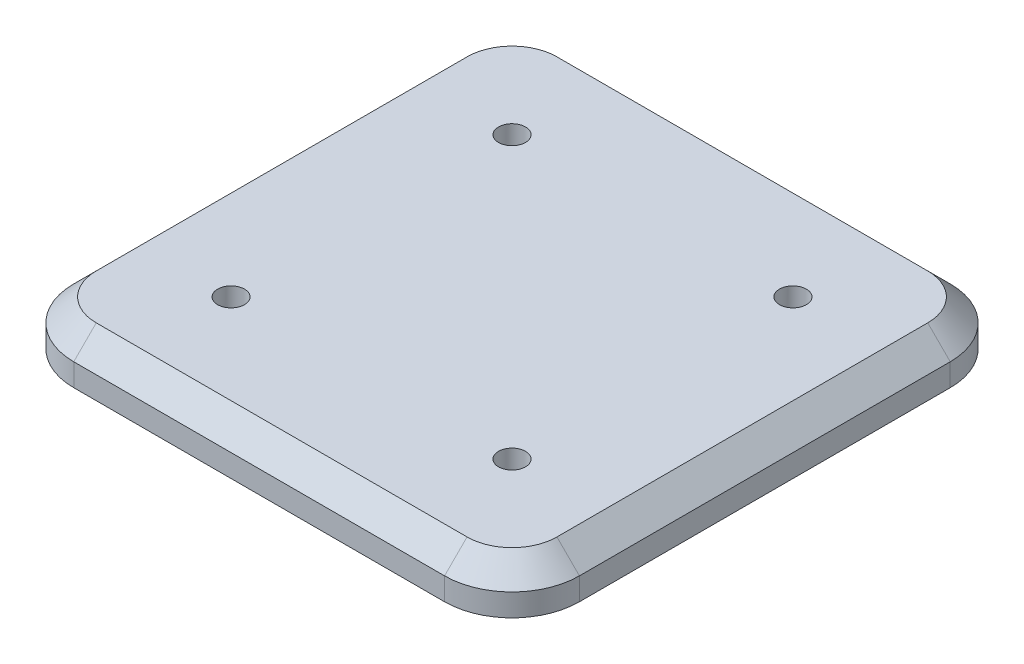
ISO-10303-21;
HEADER;
FILE_DESCRIPTION(('STEP AP214'),'2;1');
FILE_NAME('part.step','',(''),(''),'','','');
FILE_SCHEMA(('AUTOMOTIVE_DESIGN { 1 0 10303 214 1 1 1 1 }'));
ENDSEC;
DATA;
#1=APPLICATION_CONTEXT('core data for automotive mechanical design processes');
#2=APPLICATION_PROTOCOL_DEFINITION('international standard','automotive_design',2000,#1);
#3=PRODUCT_CONTEXT('',#1,'mechanical');
#4=PRODUCT('Part','Part','',(#3));
#5=PRODUCT_RELATED_PRODUCT_CATEGORY('part','',(#4));
#6=PRODUCT_DEFINITION_FORMATION('','',#4);
#7=PRODUCT_DEFINITION_CONTEXT('part definition',#1,'design');
#8=PRODUCT_DEFINITION('design','',#6,#7);
#9=PRODUCT_DEFINITION_SHAPE('','',#8);
#10=(LENGTH_UNIT() NAMED_UNIT(*) SI_UNIT(.MILLI.,.METRE.));
#11=(NAMED_UNIT(*) PLANE_ANGLE_UNIT() SI_UNIT($,.RADIAN.));
#12=(NAMED_UNIT(*) SI_UNIT($,.STERADIAN.) SOLID_ANGLE_UNIT());
#13=UNCERTAINTY_MEASURE_WITH_UNIT(LENGTH_MEASURE(1.E-05),#10,'distance_accuracy_value','');
#14=(GEOMETRIC_REPRESENTATION_CONTEXT(3) GLOBAL_UNCERTAINTY_ASSIGNED_CONTEXT((#13)) GLOBAL_UNIT_ASSIGNED_CONTEXT((#10,
#11,#12)) REPRESENTATION_CONTEXT('',''));
#15=CARTESIAN_POINT('',(0.,0.,0.));
#16=DIRECTION('',(0.,0.,1.));
#17=DIRECTION('',(1.,0.,0.));
#18=AXIS2_PLACEMENT_3D('',#15,#16,#17);
#19=CARTESIAN_POINT('',(-82.5,10.,82.5));
#20=DIRECTION('',(0.,-1.,0.));
#21=DIRECTION('',(0.,0.,-1.));
#22=AXIS2_PLACEMENT_3D('',#19,#20,#21);
#23=CYLINDRICAL_SURFACE('',#22,30.);
#24=DIRECTION('',(0.,-1.,0.));
#25=VECTOR('',#24,1.);
#26=CARTESIAN_POINT('',(-82.5,10.,112.5));
#27=LINE('',#26,#25);
#28=CARTESIAN_POINT('',(-82.5,-1.26634813746307E-13,112.5));
#29=VERTEX_POINT('',#28);
#30=CARTESIAN_POINT('',(-82.5,-10.,112.5));
#31=VERTEX_POINT('',#30);
#32=EDGE_CURVE('E130',#29,#31,#27,.T.);
#33=ORIENTED_EDGE('',*,*,#32,.F.);
#34=CARTESIAN_POINT('',(-82.5,-1.26634813746307E-13,82.5));
#35=DIRECTION('',(0.,-1.,0.));
#36=DIRECTION('',(0.,0.,-1.));
#37=AXIS2_PLACEMENT_3D('',#34,#35,#36);
#38=CIRCLE('',#37,30.);
#39=CARTESIAN_POINT('',(-112.5,-1.26634813746307E-13,82.5));
#40=VERTEX_POINT('',#39);
#41=EDGE_CURVE('E12',#29,#40,#38,.T.);
#42=ORIENTED_EDGE('',*,*,#41,.T.);
#43=DIRECTION('',(0.,-1.,0.));
#44=VECTOR('',#43,1.);
#45=CARTESIAN_POINT('',(-112.5,10.,82.5));
#46=LINE('',#45,#44);
#47=CARTESIAN_POINT('',(-112.5,-10.,82.5));
#48=VERTEX_POINT('',#47);
#49=EDGE_CURVE('E151',#40,#48,#46,.T.);
#50=ORIENTED_EDGE('',*,*,#49,.T.);
#51=CARTESIAN_POINT('',(-82.5,-10.,82.5));
#52=DIRECTION('',(0.,1.,0.));
#53=DIRECTION('',(0.,0.,-1.));
#54=AXIS2_PLACEMENT_3D('',#51,#52,#53);
#55=CIRCLE('',#54,30.);
#56=EDGE_CURVE('E145',#48,#31,#55,.T.);
#57=ORIENTED_EDGE('',*,*,#56,.T.);
#58=EDGE_LOOP('',(#33,#42,#50,#57));
#59=FACE_BOUND('',#58,.T.);
#60=ADVANCED_FACE('F41',(#59),#23,.T.);
#61=CARTESIAN_POINT('',(82.5,10.,112.5));
#62=DIRECTION('',(0.,0.,-1.));
#63=DIRECTION('',(-1.,0.,0.));
#64=AXIS2_PLACEMENT_3D('',#61,#62,#63);
#65=PLANE('',#64);
#66=DIRECTION('',(0.,-1.,0.));
#67=VECTOR('',#66,1.);
#68=CARTESIAN_POINT('',(82.5,10.,112.5));
#69=LINE('',#68,#67);
#70=CARTESIAN_POINT('',(82.5,-1.26634813746307E-13,112.5));
#71=VERTEX_POINT('',#70);
#72=CARTESIAN_POINT('',(82.5,-10.,112.5));
#73=VERTEX_POINT('',#72);
#74=EDGE_CURVE('E139',#71,#73,#69,.T.);
#75=ORIENTED_EDGE('',*,*,#74,.F.);
#76=DIRECTION('',(-1.,0.,0.));
#77=VECTOR('',#76,1.);
#78=CARTESIAN_POINT('',(82.5,-1.26634813746307E-13,112.5));
#79=LINE('',#78,#77);
#80=EDGE_CURVE('E51',#71,#29,#79,.T.);
#81=ORIENTED_EDGE('',*,*,#80,.T.);
#82=ORIENTED_EDGE('',*,*,#32,.T.);
#83=DIRECTION('',(1.,0.,0.));
#84=VECTOR('',#83,1.);
#85=CARTESIAN_POINT('',(82.5,-10.,112.5));
#86=LINE('',#85,#84);
#87=EDGE_CURVE('E133',#31,#73,#86,.T.);
#88=ORIENTED_EDGE('',*,*,#87,.T.);
#89=EDGE_LOOP('',(#75,#81,#82,#88));
#90=FACE_BOUND('',#89,.T.);
#91=ADVANCED_FACE('F132',(#90),#65,.F.);
#92=CARTESIAN_POINT('',(82.5,10.,82.5));
#93=DIRECTION('',(0.,-1.,0.));
#94=DIRECTION('',(0.,0.,-1.));
#95=AXIS2_PLACEMENT_3D('',#92,#93,#94);
#96=CYLINDRICAL_SURFACE('',#95,30.);
#97=DIRECTION('',(0.,-1.,0.));
#98=VECTOR('',#97,1.);
#99=CARTESIAN_POINT('',(112.5,10.,82.5));
#100=LINE('',#99,#98);
#101=CARTESIAN_POINT('',(112.5,-1.26634813746307E-13,82.5));
#102=VERTEX_POINT('',#101);
#103=CARTESIAN_POINT('',(112.5,-10.,82.5));
#104=VERTEX_POINT('',#103);
#105=EDGE_CURVE('E184',#102,#104,#100,.T.);
#106=ORIENTED_EDGE('',*,*,#105,.F.);
#107=CARTESIAN_POINT('',(82.5,-1.26634813746307E-13,82.5));
#108=DIRECTION('',(0.,-1.,0.));
#109=DIRECTION('',(0.,0.,-1.));
#110=AXIS2_PLACEMENT_3D('',#107,#108,#109);
#111=CIRCLE('',#110,30.);
#112=EDGE_CURVE('E66',#102,#71,#111,.T.);
#113=ORIENTED_EDGE('',*,*,#112,.T.);
#114=ORIENTED_EDGE('',*,*,#74,.T.);
#115=CARTESIAN_POINT('',(82.5,-10.,82.5));
#116=DIRECTION('',(0.,1.,0.));
#117=DIRECTION('',(0.,0.,-1.));
#118=AXIS2_PLACEMENT_3D('',#115,#116,#117);
#119=CIRCLE('',#118,30.);
#120=EDGE_CURVE('E148',#73,#104,#119,.T.);
#121=ORIENTED_EDGE('',*,*,#120,.T.);
#122=EDGE_LOOP('',(#106,#113,#114,#121));
#123=FACE_BOUND('',#122,.T.);
#124=ADVANCED_FACE('F287',(#123),#96,.T.);
#125=CARTESIAN_POINT('',(112.5,10.,-82.5));
#126=DIRECTION('',(-1.,0.,0.));
#127=DIRECTION('',(0.,0.,1.));
#128=AXIS2_PLACEMENT_3D('',#125,#126,#127);
#129=PLANE('',#128);
#130=DIRECTION('',(0.,-1.,0.));
#131=VECTOR('',#130,1.);
#132=CARTESIAN_POINT('',(112.5,10.,-82.5));
#133=LINE('',#132,#131);
#134=CARTESIAN_POINT('',(112.5,-1.26634813746307E-13,-82.5));
#135=VERTEX_POINT('',#134);
#136=CARTESIAN_POINT('',(112.5,-10.,-82.5));
#137=VERTEX_POINT('',#136);
#138=EDGE_CURVE('E182',#135,#137,#133,.T.);
#139=ORIENTED_EDGE('',*,*,#138,.F.);
#140=DIRECTION('',(0.,0.,1.));
#141=VECTOR('',#140,1.);
#142=CARTESIAN_POINT('',(112.5,-1.26634813746307E-13,-82.5));
#143=LINE('',#142,#141);
#144=EDGE_CURVE('E212',#135,#102,#143,.T.);
#145=ORIENTED_EDGE('',*,*,#144,.T.);
#146=ORIENTED_EDGE('',*,*,#105,.T.);
#147=DIRECTION('',(0.,0.,-1.));
#148=VECTOR('',#147,1.);
#149=CARTESIAN_POINT('',(112.5,-10.,-82.5));
#150=LINE('',#149,#148);
#151=EDGE_CURVE('E161',#104,#137,#150,.T.);
#152=ORIENTED_EDGE('',*,*,#151,.T.);
#153=EDGE_LOOP('',(#139,#145,#146,#152));
#154=FACE_BOUND('',#153,.T.);
#155=ADVANCED_FACE('F285',(#154),#129,.F.);
#156=CARTESIAN_POINT('',(82.5,10.,-82.5));
#157=DIRECTION('',(0.,-1.,0.));
#158=DIRECTION('',(0.,0.,-1.));
#159=AXIS2_PLACEMENT_3D('',#156,#157,#158);
#160=CYLINDRICAL_SURFACE('',#159,30.);
#161=DIRECTION('',(0.,-1.,0.));
#162=VECTOR('',#161,1.);
#163=CARTESIAN_POINT('',(82.4999999999999,10.,-112.5));
#164=LINE('',#163,#162);
#165=CARTESIAN_POINT('',(82.4999999999999,-1.26634813746307E-13,-112.5));
#166=VERTEX_POINT('',#165);
#167=CARTESIAN_POINT('',(82.4999999999999,-10.,-112.5));
#168=VERTEX_POINT('',#167);
#169=EDGE_CURVE('E180',#166,#168,#164,.T.);
#170=ORIENTED_EDGE('',*,*,#169,.F.);
#171=CARTESIAN_POINT('',(82.5,-1.26634813746307E-13,-82.5));
#172=DIRECTION('',(0.,-1.,0.));
#173=DIRECTION('',(0.,0.,-1.));
#174=AXIS2_PLACEMENT_3D('',#171,#172,#173);
#175=CIRCLE('',#174,30.);
#176=EDGE_CURVE('E210',#166,#135,#175,.T.);
#177=ORIENTED_EDGE('',*,*,#176,.T.);
#178=ORIENTED_EDGE('',*,*,#138,.T.);
#179=CARTESIAN_POINT('',(82.5,-10.,-82.5));
#180=DIRECTION('',(0.,1.,0.));
#181=DIRECTION('',(0.,0.,-1.));
#182=AXIS2_PLACEMENT_3D('',#179,#180,#181);
#183=CIRCLE('',#182,30.);
#184=EDGE_CURVE('E164',#137,#168,#183,.T.);
#185=ORIENTED_EDGE('',*,*,#184,.T.);
#186=EDGE_LOOP('',(#170,#177,#178,#185));
#187=FACE_BOUND('',#186,.T.);
#188=ADVANCED_FACE('F283',(#187),#160,.T.);
#189=CARTESIAN_POINT('',(-82.5,10.,-112.5));
#190=DIRECTION('',(0.,0.,1.));
#191=DIRECTION('',(1.,0.,0.));
#192=AXIS2_PLACEMENT_3D('',#189,#190,#191);
#193=PLANE('',#192);
#194=DIRECTION('',(0.,-1.,0.));
#195=VECTOR('',#194,1.);
#196=CARTESIAN_POINT('',(-82.5,10.,-112.5));
#197=LINE('',#196,#195);
#198=CARTESIAN_POINT('',(-82.5,-1.26634813746307E-13,-112.5));
#199=VERTEX_POINT('',#198);
#200=CARTESIAN_POINT('',(-82.5,-10.,-112.5));
#201=VERTEX_POINT('',#200);
#202=EDGE_CURVE('E178',#199,#201,#197,.T.);
#203=ORIENTED_EDGE('',*,*,#202,.F.);
#204=DIRECTION('',(1.,0.,0.));
#205=VECTOR('',#204,1.);
#206=CARTESIAN_POINT('',(-82.5,-1.26634813746307E-13,-112.5));
#207=LINE('',#206,#205);
#208=EDGE_CURVE('E208',#199,#166,#207,.T.);
#209=ORIENTED_EDGE('',*,*,#208,.T.);
#210=ORIENTED_EDGE('',*,*,#169,.T.);
#211=DIRECTION('',(-1.,0.,0.));
#212=VECTOR('',#211,1.);
#213=CARTESIAN_POINT('',(-82.5,-10.,-112.5));
#214=LINE('',#213,#212);
#215=EDGE_CURVE('E167',#168,#201,#214,.T.);
#216=ORIENTED_EDGE('',*,*,#215,.T.);
#217=EDGE_LOOP('',(#203,#209,#210,#216));
#218=FACE_BOUND('',#217,.T.);
#219=ADVANCED_FACE('F271',(#218),#193,.F.);
#220=CARTESIAN_POINT('',(-82.5,10.,-82.5));
#221=DIRECTION('',(0.,-1.,0.));
#222=DIRECTION('',(0.,0.,-1.));
#223=AXIS2_PLACEMENT_3D('',#220,#221,#222);
#224=CYLINDRICAL_SURFACE('',#223,30.);
#225=DIRECTION('',(0.,-1.,0.));
#226=VECTOR('',#225,1.);
#227=CARTESIAN_POINT('',(-112.5,10.,-82.5));
#228=LINE('',#227,#226);
#229=CARTESIAN_POINT('',(-112.5,-1.26634813746307E-13,-82.5));
#230=VERTEX_POINT('',#229);
#231=CARTESIAN_POINT('',(-112.5,-10.,-82.5));
#232=VERTEX_POINT('',#231);
#233=EDGE_CURVE('E176',#230,#232,#228,.T.);
#234=ORIENTED_EDGE('',*,*,#233,.F.);
#235=CARTESIAN_POINT('',(-82.5,-1.26634813746307E-13,-82.5));
#236=DIRECTION('',(0.,-1.,0.));
#237=DIRECTION('',(0.,0.,-1.));
#238=AXIS2_PLACEMENT_3D('',#235,#236,#237);
#239=CIRCLE('',#238,30.);
#240=EDGE_CURVE('E206',#230,#199,#239,.T.);
#241=ORIENTED_EDGE('',*,*,#240,.T.);
#242=ORIENTED_EDGE('',*,*,#202,.T.);
#243=CARTESIAN_POINT('',(-82.5,-10.,-82.5));
#244=DIRECTION('',(0.,1.,0.));
#245=DIRECTION('',(0.,0.,1.));
#246=AXIS2_PLACEMENT_3D('',#243,#244,#245);
#247=CIRCLE('',#246,30.);
#248=EDGE_CURVE('E170',#201,#232,#247,.T.);
#249=ORIENTED_EDGE('',*,*,#248,.T.);
#250=EDGE_LOOP('',(#234,#241,#242,#249));
#251=FACE_BOUND('',#250,.T.);
#252=ADVANCED_FACE('F268',(#251),#224,.T.);
#253=CARTESIAN_POINT('',(-112.5,10.,82.5));
#254=DIRECTION('',(1.,0.,0.));
#255=DIRECTION('',(0.,0.,-1.));
#256=AXIS2_PLACEMENT_3D('',#253,#254,#255);
#257=PLANE('',#256);
#258=ORIENTED_EDGE('',*,*,#49,.F.);
#259=DIRECTION('',(0.,0.,-1.));
#260=VECTOR('',#259,1.);
#261=CARTESIAN_POINT('',(-112.5,-1.26634813746307E-13,82.5));
#262=LINE('',#261,#260);
#263=EDGE_CURVE('E203',#40,#230,#262,.T.);
#264=ORIENTED_EDGE('',*,*,#263,.T.);
#265=ORIENTED_EDGE('',*,*,#233,.T.);
#266=DIRECTION('',(0.,0.,1.));
#267=VECTOR('',#266,1.);
#268=CARTESIAN_POINT('',(-112.5,-10.,82.5));
#269=LINE('',#268,#267);
#270=EDGE_CURVE('E173',#232,#48,#269,.T.);
#271=ORIENTED_EDGE('',*,*,#270,.T.);
#272=EDGE_LOOP('',(#258,#264,#265,#271));
#273=FACE_BOUND('',#272,.T.);
#274=ADVANCED_FACE('F255',(#273),#257,.F.);
#275=CARTESIAN_POINT('',(-82.5,10.,82.5));
#276=DIRECTION('',(0.,-1.,0.));
#277=DIRECTION('',(0.,0.,-1.));
#278=AXIS2_PLACEMENT_3D('',#275,#276,#277);
#279=PLANE('',#278);
#280=CARTESIAN_POINT('',(-62.4999999999999,10.,-62.4999999999999));
#281=DIRECTION('',(0.,1.,0.));
#282=DIRECTION('',(0.,0.,-1.));
#283=AXIS2_PLACEMENT_3D('',#280,#281,#282);
#284=CIRCLE('',#283,6.);
#285=CARTESIAN_POINT('',(-62.4999999999999,10.,-68.4999999999999));
#286=VERTEX_POINT('',#285);
#287=EDGE_CURVE('E579',#286,#286,#284,.T.);
#288=ORIENTED_EDGE('',*,*,#287,.F.);
#289=EDGE_LOOP('',(#288));
#290=FACE_BOUND('',#289,.T.);
#291=CARTESIAN_POINT('',(62.5,10.,62.5));
#292=DIRECTION('',(0.,1.,0.));
#293=DIRECTION('',(0.,0.,-1.));
#294=AXIS2_PLACEMENT_3D('',#291,#292,#293);
#295=CIRCLE('',#294,6.);
#296=CARTESIAN_POINT('',(62.5,10.,56.5));
#297=VERTEX_POINT('',#296);
#298=EDGE_CURVE('E578',#297,#297,#295,.T.);
#299=ORIENTED_EDGE('',*,*,#298,.F.);
#300=EDGE_LOOP('',(#299));
#301=FACE_BOUND('',#300,.T.);
#302=CARTESIAN_POINT('',(-62.4999999999999,10.,62.4999999999999));
#303=DIRECTION('',(0.,1.,0.));
#304=DIRECTION('',(0.,0.,1.));
#305=AXIS2_PLACEMENT_3D('',#302,#303,#304);
#306=CIRCLE('',#305,6.);
#307=CARTESIAN_POINT('',(-62.4999999999999,10.,68.4999999999999));
#308=VERTEX_POINT('',#307);
#309=EDGE_CURVE('E572',#308,#308,#306,.T.);
#310=ORIENTED_EDGE('',*,*,#309,.F.);
#311=EDGE_LOOP('',(#310));
#312=FACE_BOUND('',#311,.T.);
#313=CARTESIAN_POINT('',(62.5,10.,-62.5));
#314=DIRECTION('',(0.,1.,0.));
#315=DIRECTION('',(0.,0.,1.));
#316=AXIS2_PLACEMENT_3D('',#313,#314,#315);
#317=CIRCLE('',#316,6.);
#318=CARTESIAN_POINT('',(62.5,10.,-56.5));
#319=VERTEX_POINT('',#318);
#320=EDGE_CURVE('E586',#319,#319,#317,.T.);
#321=ORIENTED_EDGE('',*,*,#320,.F.);
#322=EDGE_LOOP('',(#321));
#323=FACE_BOUND('',#322,.T.);
#324=CARTESIAN_POINT('',(-82.5,10.,-82.5));
#325=DIRECTION('',(0.,-1.,0.));
#326=DIRECTION('',(0.,0.,-1.));
#327=AXIS2_PLACEMENT_3D('',#324,#325,#326);
#328=CIRCLE('',#327,19.9999999999999);
#329=CARTESIAN_POINT('',(-82.5,10.,-102.5));
#330=VERTEX_POINT('',#329);
#331=CARTESIAN_POINT('',(-102.5,10.,-82.5));
#332=VERTEX_POINT('',#331);
#333=EDGE_CURVE('E198',#330,#332,#328,.F.);
#334=ORIENTED_EDGE('',*,*,#333,.T.);
#335=DIRECTION('',(0.,0.,1.));
#336=VECTOR('',#335,1.);
#337=CARTESIAN_POINT('',(-102.5,10.,82.5));
#338=LINE('',#337,#336);
#339=CARTESIAN_POINT('',(-102.5,10.,82.5));
#340=VERTEX_POINT('',#339);
#341=EDGE_CURVE('E200',#332,#340,#338,.T.);
#342=ORIENTED_EDGE('',*,*,#341,.T.);
#343=CARTESIAN_POINT('',(-82.5,10.,82.5));
#344=DIRECTION('',(0.,-1.,0.));
#345=DIRECTION('',(0.,0.,-1.));
#346=AXIS2_PLACEMENT_3D('',#343,#344,#345);
#347=CIRCLE('',#346,19.9999999999999);
#348=CARTESIAN_POINT('',(-82.5,10.,102.5));
#349=VERTEX_POINT('',#348);
#350=EDGE_CURVE('E138',#340,#349,#347,.F.);
#351=ORIENTED_EDGE('',*,*,#350,.T.);
#352=DIRECTION('',(1.,0.,0.));
#353=VECTOR('',#352,1.);
#354=CARTESIAN_POINT('',(-82.5,10.,102.5));
#355=LINE('',#354,#353);
#356=CARTESIAN_POINT('',(82.5,10.,102.5));
#357=VERTEX_POINT('',#356);
#358=EDGE_CURVE('E188',#349,#357,#355,.T.);
#359=ORIENTED_EDGE('',*,*,#358,.T.);
#360=CARTESIAN_POINT('',(82.5,10.,82.5));
#361=DIRECTION('',(0.,-1.,0.));
#362=DIRECTION('',(0.,0.,-1.));
#363=AXIS2_PLACEMENT_3D('',#360,#361,#362);
#364=CIRCLE('',#363,19.9999999999999);
#365=CARTESIAN_POINT('',(102.5,10.,82.5));
#366=VERTEX_POINT('',#365);
#367=EDGE_CURVE('E190',#357,#366,#364,.F.);
#368=ORIENTED_EDGE('',*,*,#367,.T.);
#369=DIRECTION('',(0.,0.,-1.));
#370=VECTOR('',#369,1.);
#371=CARTESIAN_POINT('',(102.5,10.,82.5));
#372=LINE('',#371,#370);
#373=CARTESIAN_POINT('',(102.5,10.,-82.5));
#374=VERTEX_POINT('',#373);
#375=EDGE_CURVE('E192',#366,#374,#372,.T.);
#376=ORIENTED_EDGE('',*,*,#375,.T.);
#377=CARTESIAN_POINT('',(82.5,10.,-82.5));
#378=DIRECTION('',(0.,-1.,0.));
#379=DIRECTION('',(0.,0.,-1.));
#380=AXIS2_PLACEMENT_3D('',#377,#378,#379);
#381=CIRCLE('',#380,19.9999999999999);
#382=CARTESIAN_POINT('',(82.4999999999999,10.,-102.5));
#383=VERTEX_POINT('',#382);
#384=EDGE_CURVE('E194',#374,#383,#381,.F.);
#385=ORIENTED_EDGE('',*,*,#384,.T.);
#386=DIRECTION('',(-1.,0.,0.));
#387=VECTOR('',#386,1.);
#388=CARTESIAN_POINT('',(-82.5,10.,-102.5));
#389=LINE('',#388,#387);
#390=EDGE_CURVE('E196',#383,#330,#389,.T.);
#391=ORIENTED_EDGE('',*,*,#390,.T.);
#392=EDGE_LOOP('',(#334,#342,#351,#359,#368,#376,#385,#391));
#393=FACE_BOUND('',#392,.T.);
#394=ADVANCED_FACE('F243',(#290,#301,#312,#323,#393),#279,.F.);
#395=CARTESIAN_POINT('',(-82.5,-10.,82.5));
#396=DIRECTION('',(0.,-1.,0.));
#397=DIRECTION('',(0.,0.,-1.));
#398=AXIS2_PLACEMENT_3D('',#395,#396,#397);
#399=PLANE('',#398);
#400=CARTESIAN_POINT('',(-87.5,-10.,87.4999999999999));
#401=DIRECTION('',(0.,-1.,0.));
#402=DIRECTION('',(0.,0.,1.));
#403=AXIS2_PLACEMENT_3D('',#400,#401,#402);
#404=CIRCLE('',#403,6.);
#405=CARTESIAN_POINT('',(-87.5,-10.,93.4999999999999));
#406=VERTEX_POINT('',#405);
#407=EDGE_CURVE('E554',#406,#406,#404,.T.);
#408=ORIENTED_EDGE('',*,*,#407,.F.);
#409=EDGE_LOOP('',(#408));
#410=FACE_BOUND('',#409,.T.);
#411=CARTESIAN_POINT('',(87.5,-10.,-87.5));
#412=DIRECTION('',(0.,-1.,0.));
#413=DIRECTION('',(0.,0.,1.));
#414=AXIS2_PLACEMENT_3D('',#411,#412,#413);
#415=CIRCLE('',#414,6.);
#416=CARTESIAN_POINT('',(87.5,-10.,-81.5));
#417=VERTEX_POINT('',#416);
#418=EDGE_CURVE('E564',#417,#417,#415,.T.);
#419=ORIENTED_EDGE('',*,*,#418,.F.);
#420=EDGE_LOOP('',(#419));
#421=FACE_BOUND('',#420,.T.);
#422=CARTESIAN_POINT('',(-87.5,-10.,-87.4999999999999));
#423=DIRECTION('',(0.,-1.,0.));
#424=DIRECTION('',(0.,0.,-1.));
#425=AXIS2_PLACEMENT_3D('',#422,#423,#424);
#426=CIRCLE('',#425,6.);
#427=CARTESIAN_POINT('',(-87.5,-10.,-93.4999999999999));
#428=VERTEX_POINT('',#427);
#429=EDGE_CURVE('E617',#428,#428,#426,.T.);
#430=ORIENTED_EDGE('',*,*,#429,.F.);
#431=EDGE_LOOP('',(#430));
#432=FACE_BOUND('',#431,.T.);
#433=CARTESIAN_POINT('',(87.5,-10.,87.5));
#434=DIRECTION('',(0.,-1.,0.));
#435=DIRECTION('',(0.,0.,-1.));
#436=AXIS2_PLACEMENT_3D('',#433,#434,#435);
#437=CIRCLE('',#436,6.);
#438=CARTESIAN_POINT('',(87.5,-10.,81.5));
#439=VERTEX_POINT('',#438);
#440=EDGE_CURVE('E553',#439,#439,#437,.T.);
#441=ORIENTED_EDGE('',*,*,#440,.F.);
#442=EDGE_LOOP('',(#441));
#443=FACE_BOUND('',#442,.T.);
#444=ORIENTED_EDGE('',*,*,#56,.F.);
#445=ORIENTED_EDGE('',*,*,#270,.F.);
#446=ORIENTED_EDGE('',*,*,#248,.F.);
#447=ORIENTED_EDGE('',*,*,#215,.F.);
#448=ORIENTED_EDGE('',*,*,#184,.F.);
#449=ORIENTED_EDGE('',*,*,#151,.F.);
#450=ORIENTED_EDGE('',*,*,#120,.F.);
#451=ORIENTED_EDGE('',*,*,#87,.F.);
#452=EDGE_LOOP('',(#444,#445,#446,#447,#448,#449,#450,#451));
#453=FACE_BOUND('',#452,.T.);
#454=ADVANCED_FACE('F143',(#410,#421,#432,#443,#453),#399,.T.);
#455=CARTESIAN_POINT('',(102.5,10.,82.5));
#456=DIRECTION('',(-0.707106781186549,-0.707106781186546,0.));
#457=DIRECTION('',(0.,0.,-1.));
#458=AXIS2_PLACEMENT_3D('',#455,#456,#457);
#459=PLANE('',#458);
#460=DIRECTION('',(-0.707106781186546,0.707106781186549,0.));
#461=VECTOR('',#460,1.);
#462=CARTESIAN_POINT('',(112.5,-1.26634813746307E-13,82.5));
#463=LINE('',#462,#461);
#464=EDGE_CURVE('E155',#102,#366,#463,.T.);
#465=ORIENTED_EDGE('',*,*,#464,.F.);
#466=ORIENTED_EDGE('',*,*,#144,.F.);
#467=DIRECTION('',(0.707106781186546,-0.707106781186549,0.));
#468=VECTOR('',#467,1.);
#469=CARTESIAN_POINT('',(102.5,10.,-82.5));
#470=LINE('',#469,#468);
#471=EDGE_CURVE('E46',#374,#135,#470,.T.);
#472=ORIENTED_EDGE('',*,*,#471,.F.);
#473=ORIENTED_EDGE('',*,*,#375,.F.);
#474=EDGE_LOOP('',(#465,#466,#472,#473));
#475=FACE_BOUND('',#474,.T.);
#476=ADVANCED_FACE('F44',(#475),#459,.F.);
#477=CARTESIAN_POINT('',(82.5,10.,-82.5));
#478=DIRECTION('',(0.,-1.,0.));
#479=DIRECTION('',(0.,0.,-1.));
#480=AXIS2_PLACEMENT_3D('',#477,#478,#479);
#481=CONICAL_SURFACE('',#480,19.9999999999999,0.785398163397446);
#482=ORIENTED_EDGE('',*,*,#471,.T.);
#483=ORIENTED_EDGE('',*,*,#176,.F.);
#484=DIRECTION('',(0.,-0.707106781186549,-0.707106781186546));
#485=VECTOR('',#484,1.);
#486=CARTESIAN_POINT('',(82.4999999999999,10.,-102.5));
#487=LINE('',#486,#485);
#488=EDGE_CURVE('E229',#383,#166,#487,.T.);
#489=ORIENTED_EDGE('',*,*,#488,.F.);
#490=ORIENTED_EDGE('',*,*,#384,.F.);
#491=EDGE_LOOP('',(#482,#483,#489,#490));
#492=FACE_BOUND('',#491,.T.);
#493=ADVANCED_FACE('F280',(#492),#481,.T.);
#494=CARTESIAN_POINT('',(82.5,10.,82.5));
#495=DIRECTION('',(0.,-1.,0.));
#496=DIRECTION('',(0.,0.,-1.));
#497=AXIS2_PLACEMENT_3D('',#494,#495,#496);
#498=CONICAL_SURFACE('',#497,19.9999999999999,0.785398163397446);
#499=ORIENTED_EDGE('',*,*,#464,.T.);
#500=ORIENTED_EDGE('',*,*,#367,.F.);
#501=DIRECTION('',(0.,0.707106781186549,-0.707106781186546));
#502=VECTOR('',#501,1.);
#503=CARTESIAN_POINT('',(82.5,-1.26634813746307E-13,112.5));
#504=LINE('',#503,#502);
#505=EDGE_CURVE('E226',#71,#357,#504,.T.);
#506=ORIENTED_EDGE('',*,*,#505,.F.);
#507=ORIENTED_EDGE('',*,*,#112,.F.);
#508=EDGE_LOOP('',(#499,#500,#506,#507));
#509=FACE_BOUND('',#508,.T.);
#510=ADVANCED_FACE('F235',(#509),#498,.T.);
#511=CARTESIAN_POINT('',(-82.5,10.,-102.5));
#512=DIRECTION('',(0.,-0.707106781186546,0.707106781186549));
#513=DIRECTION('',(-1.,0.,0.));
#514=AXIS2_PLACEMENT_3D('',#511,#512,#513);
#515=PLANE('',#514);
#516=ORIENTED_EDGE('',*,*,#488,.T.);
#517=ORIENTED_EDGE('',*,*,#208,.F.);
#518=DIRECTION('',(0.,-0.707106781186549,-0.707106781186546));
#519=VECTOR('',#518,1.);
#520=CARTESIAN_POINT('',(-82.5,10.,-102.5));
#521=LINE('',#520,#519);
#522=EDGE_CURVE('E223',#330,#199,#521,.T.);
#523=ORIENTED_EDGE('',*,*,#522,.F.);
#524=ORIENTED_EDGE('',*,*,#390,.F.);
#525=EDGE_LOOP('',(#516,#517,#523,#524));
#526=FACE_BOUND('',#525,.T.);
#527=ADVANCED_FACE('F276',(#526),#515,.F.);
#528=CARTESIAN_POINT('',(-82.5,10.,102.5));
#529=DIRECTION('',(0.,-0.707106781186546,-0.707106781186549));
#530=DIRECTION('',(1.,0.,0.));
#531=AXIS2_PLACEMENT_3D('',#528,#529,#530);
#532=PLANE('',#531);
#533=ORIENTED_EDGE('',*,*,#505,.T.);
#534=ORIENTED_EDGE('',*,*,#358,.F.);
#535=DIRECTION('',(0.,0.707106781186549,-0.707106781186546));
#536=VECTOR('',#535,1.);
#537=CARTESIAN_POINT('',(-82.5,-1.26634813746307E-13,112.5));
#538=LINE('',#537,#536);
#539=EDGE_CURVE('E220',#29,#349,#538,.T.);
#540=ORIENTED_EDGE('',*,*,#539,.F.);
#541=ORIENTED_EDGE('',*,*,#80,.F.);
#542=EDGE_LOOP('',(#533,#534,#540,#541));
#543=FACE_BOUND('',#542,.T.);
#544=ADVANCED_FACE('F248',(#543),#532,.F.);
#545=CARTESIAN_POINT('',(-82.5,10.,-82.5));
#546=DIRECTION('',(0.,-1.,0.));
#547=DIRECTION('',(0.,0.,-1.));
#548=AXIS2_PLACEMENT_3D('',#545,#546,#547);
#549=CONICAL_SURFACE('',#548,19.9999999999999,0.785398163397446);
#550=ORIENTED_EDGE('',*,*,#522,.T.);
#551=ORIENTED_EDGE('',*,*,#240,.F.);
#552=DIRECTION('',(-0.707106781186546,-0.707106781186549,0.));
#553=VECTOR('',#552,1.);
#554=CARTESIAN_POINT('',(-102.5,10.,-82.5));
#555=LINE('',#554,#553);
#556=EDGE_CURVE('E218',#332,#230,#555,.T.);
#557=ORIENTED_EDGE('',*,*,#556,.F.);
#558=ORIENTED_EDGE('',*,*,#333,.F.);
#559=EDGE_LOOP('',(#550,#551,#557,#558));
#560=FACE_BOUND('',#559,.T.);
#561=ADVANCED_FACE('F264',(#560),#549,.T.);
#562=CARTESIAN_POINT('',(-82.5,10.,82.5));
#563=DIRECTION('',(0.,-1.,0.));
#564=DIRECTION('',(0.,0.,-1.));
#565=AXIS2_PLACEMENT_3D('',#562,#563,#564);
#566=CONICAL_SURFACE('',#565,19.9999999999999,0.785398163397446);
#567=ORIENTED_EDGE('',*,*,#539,.T.);
#568=ORIENTED_EDGE('',*,*,#350,.F.);
#569=DIRECTION('',(0.707106781186546,0.707106781186549,0.));
#570=VECTOR('',#569,1.);
#571=CARTESIAN_POINT('',(-112.5,-1.26634813746307E-13,82.5));
#572=LINE('',#571,#570);
#573=EDGE_CURVE('E216',#40,#340,#572,.T.);
#574=ORIENTED_EDGE('',*,*,#573,.F.);
#575=ORIENTED_EDGE('',*,*,#41,.F.);
#576=EDGE_LOOP('',(#567,#568,#574,#575));
#577=FACE_BOUND('',#576,.T.);
#578=ADVANCED_FACE('F251',(#577),#566,.T.);
#579=CARTESIAN_POINT('',(-102.5,10.,82.5));
#580=DIRECTION('',(0.707106781186549,-0.707106781186546,0.));
#581=DIRECTION('',(0.,0.,1.));
#582=AXIS2_PLACEMENT_3D('',#579,#580,#581);
#583=PLANE('',#582);
#584=ORIENTED_EDGE('',*,*,#556,.T.);
#585=ORIENTED_EDGE('',*,*,#263,.F.);
#586=ORIENTED_EDGE('',*,*,#573,.T.);
#587=ORIENTED_EDGE('',*,*,#341,.F.);
#588=EDGE_LOOP('',(#584,#585,#586,#587));
#589=FACE_BOUND('',#588,.T.);
#590=ADVANCED_FACE('F258',(#589),#583,.F.);
#591=CARTESIAN_POINT('',(-82.5,0.,82.5));
#592=DIRECTION('',(0.,-1.,0.));
#593=DIRECTION('',(0.,0.,-1.));
#594=AXIS2_PLACEMENT_3D('',#591,#592,#593);
#595=PLANE('',#594);
#596=CARTESIAN_POINT('',(62.5,0.,-62.5));
#597=DIRECTION('',(0.,-1.,0.));
#598=DIRECTION('',(0.,0.,-1.));
#599=AXIS2_PLACEMENT_3D('',#596,#597,#598);
#600=CIRCLE('',#599,6.);
#601=CARTESIAN_POINT('',(62.5,0.,-68.5));
#602=VERTEX_POINT('',#601);
#603=EDGE_CURVE('E157',#602,#602,#600,.F.);
#604=ORIENTED_EDGE('',*,*,#603,.T.);
#605=EDGE_LOOP('',(#604));
#606=FACE_BOUND('',#605,.T.);
#607=ADVANCED_FACE('F307',(#606),#595,.F.);
#608=CARTESIAN_POINT('',(62.5,-26.9705627484772,-62.5));
#609=DIRECTION('',(0.,1.,0.));
#610=DIRECTION('',(0.,0.,1.));
#611=AXIS2_PLACEMENT_3D('',#608,#609,#610);
#612=CYLINDRICAL_SURFACE('',#611,6.);
#613=ORIENTED_EDGE('',*,*,#320,.T.);
#614=EDGE_LOOP('',(#613));
#615=FACE_BOUND('',#614,.T.);
#616=ORIENTED_EDGE('',*,*,#603,.F.);
#617=EDGE_LOOP('',(#616));
#618=FACE_BOUND('',#617,.T.);
#619=ADVANCED_FACE('F393',(#615,#618),#612,.F.);
#620=CARTESIAN_POINT('',(-82.5,0.,82.5));
#621=DIRECTION('',(0.,-1.,0.));
#622=DIRECTION('',(0.,0.,-1.));
#623=AXIS2_PLACEMENT_3D('',#620,#621,#622);
#624=PLANE('',#623);
#625=CARTESIAN_POINT('',(-62.4999999999999,0.,62.4999999999999));
#626=DIRECTION('',(0.,-1.,0.));
#627=DIRECTION('',(0.,0.,-1.));
#628=AXIS2_PLACEMENT_3D('',#625,#626,#627);
#629=CIRCLE('',#628,6.);
#630=CARTESIAN_POINT('',(-62.4999999999999,0.,56.4999999999999));
#631=VERTEX_POINT('',#630);
#632=EDGE_CURVE('E575',#631,#631,#629,.F.);
#633=ORIENTED_EDGE('',*,*,#632,.T.);
#634=EDGE_LOOP('',(#633));
#635=FACE_BOUND('',#634,.T.);
#636=ADVANCED_FACE('F402',(#635),#624,.F.);
#637=CARTESIAN_POINT('',(-62.4999999999999,-26.9705627484772,62.4999999999999));
#638=DIRECTION('',(0.,1.,0.));
#639=DIRECTION('',(0.,0.,1.));
#640=AXIS2_PLACEMENT_3D('',#637,#638,#639);
#641=CYLINDRICAL_SURFACE('',#640,6.);
#642=ORIENTED_EDGE('',*,*,#309,.T.);
#643=EDGE_LOOP('',(#642));
#644=FACE_BOUND('',#643,.T.);
#645=ORIENTED_EDGE('',*,*,#632,.F.);
#646=EDGE_LOOP('',(#645));
#647=FACE_BOUND('',#646,.T.);
#648=ADVANCED_FACE('F412',(#644,#647),#641,.F.);
#649=CARTESIAN_POINT('',(-82.5,0.,82.5));
#650=DIRECTION('',(0.,-1.,0.));
#651=DIRECTION('',(0.,0.,-1.));
#652=AXIS2_PLACEMENT_3D('',#649,#650,#651);
#653=PLANE('',#652);
#654=CARTESIAN_POINT('',(62.5,0.,62.5));
#655=DIRECTION('',(0.,-1.,0.));
#656=DIRECTION('',(0.,0.,-1.));
#657=AXIS2_PLACEMENT_3D('',#654,#655,#656);
#658=CIRCLE('',#657,6.);
#659=CARTESIAN_POINT('',(62.5,0.,56.5));
#660=VERTEX_POINT('',#659);
#661=EDGE_CURVE('E583',#660,#660,#658,.F.);
#662=ORIENTED_EDGE('',*,*,#661,.T.);
#663=EDGE_LOOP('',(#662));
#664=FACE_BOUND('',#663,.T.);
#665=ADVANCED_FACE('F422',(#664),#653,.F.);
#666=CARTESIAN_POINT('',(62.5,-26.9705627484772,62.5));
#667=DIRECTION('',(0.,1.,0.));
#668=DIRECTION('',(0.,0.,1.));
#669=AXIS2_PLACEMENT_3D('',#666,#667,#668);
#670=CYLINDRICAL_SURFACE('',#669,6.);
#671=ORIENTED_EDGE('',*,*,#298,.T.);
#672=EDGE_LOOP('',(#671));
#673=FACE_BOUND('',#672,.T.);
#674=ORIENTED_EDGE('',*,*,#661,.F.);
#675=EDGE_LOOP('',(#674));
#676=FACE_BOUND('',#675,.T.);
#677=ADVANCED_FACE('F432',(#673,#676),#670,.F.);
#678=CARTESIAN_POINT('',(-82.5,0.,82.5));
#679=DIRECTION('',(0.,-1.,0.));
#680=DIRECTION('',(0.,0.,-1.));
#681=AXIS2_PLACEMENT_3D('',#678,#679,#680);
#682=PLANE('',#681);
#683=CARTESIAN_POINT('',(-62.4999999999999,0.,-62.4999999999999));
#684=DIRECTION('',(0.,-1.,0.));
#685=DIRECTION('',(0.,0.,-1.));
#686=AXIS2_PLACEMENT_3D('',#683,#684,#685);
#687=CIRCLE('',#686,6.);
#688=CARTESIAN_POINT('',(-62.4999999999999,0.,-68.4999999999999));
#689=VERTEX_POINT('',#688);
#690=EDGE_CURVE('E582',#689,#689,#687,.F.);
#691=ORIENTED_EDGE('',*,*,#690,.T.);
#692=EDGE_LOOP('',(#691));
#693=FACE_BOUND('',#692,.T.);
#694=ADVANCED_FACE('F442',(#693),#682,.F.);
#695=CARTESIAN_POINT('',(-62.4999999999999,-26.9705627484772,-62.4999999999999));
#696=DIRECTION('',(0.,1.,0.));
#697=DIRECTION('',(0.,0.,1.));
#698=AXIS2_PLACEMENT_3D('',#695,#696,#697);
#699=CYLINDRICAL_SURFACE('',#698,6.);
#700=ORIENTED_EDGE('',*,*,#287,.T.);
#701=EDGE_LOOP('',(#700));
#702=FACE_BOUND('',#701,.T.);
#703=ORIENTED_EDGE('',*,*,#690,.F.);
#704=EDGE_LOOP('',(#703));
#705=FACE_BOUND('',#704,.T.);
#706=ADVANCED_FACE('F452',(#702,#705),#699,.F.);
#707=CARTESIAN_POINT('',(87.5,26.9705627484772,87.5));
#708=DIRECTION('',(0.,-1.,0.));
#709=DIRECTION('',(0.,0.,-1.));
#710=AXIS2_PLACEMENT_3D('',#707,#708,#709);
#711=CYLINDRICAL_SURFACE('',#710,6.);
#712=CARTESIAN_POINT('',(87.5,0.,87.5));
#713=DIRECTION('',(0.,-1.,0.));
#714=DIRECTION('',(0.,0.,-1.));
#715=AXIS2_PLACEMENT_3D('',#712,#713,#714);
#716=CIRCLE('',#715,6.);
#717=CARTESIAN_POINT('',(87.5,0.,81.5));
#718=VERTEX_POINT('',#717);
#719=EDGE_CURVE('E557',#718,#718,#716,.F.);
#720=ORIENTED_EDGE('',*,*,#719,.T.);
#721=EDGE_LOOP('',(#720));
#722=FACE_BOUND('',#721,.T.);
#723=ORIENTED_EDGE('',*,*,#440,.T.);
#724=EDGE_LOOP('',(#723));
#725=FACE_BOUND('',#724,.T.);
#726=ADVANCED_FACE('F461',(#722,#725),#711,.F.);
#727=CARTESIAN_POINT('',(-82.5,0.,82.5));
#728=DIRECTION('',(0.,-1.,0.));
#729=DIRECTION('',(0.,0.,-1.));
#730=AXIS2_PLACEMENT_3D('',#727,#728,#729);
#731=PLANE('',#730);
#732=ORIENTED_EDGE('',*,*,#719,.F.);
#733=EDGE_LOOP('',(#732));
#734=FACE_BOUND('',#733,.T.);
#735=ADVANCED_FACE('F476',(#734),#731,.T.);
#736=CARTESIAN_POINT('',(-87.5,26.9705627484772,-87.4999999999999));
#737=DIRECTION('',(0.,-1.,0.));
#738=DIRECTION('',(0.,0.,-1.));
#739=AXIS2_PLACEMENT_3D('',#736,#737,#738);
#740=CYLINDRICAL_SURFACE('',#739,6.);
#741=CARTESIAN_POINT('',(-87.5,0.,-87.4999999999999));
#742=DIRECTION('',(0.,-1.,0.));
#743=DIRECTION('',(0.,0.,-1.));
#744=AXIS2_PLACEMENT_3D('',#741,#742,#743);
#745=CIRCLE('',#744,6.);
#746=CARTESIAN_POINT('',(-87.5,0.,-93.4999999999999));
#747=VERTEX_POINT('',#746);
#748=EDGE_CURVE('E567',#747,#747,#745,.F.);
#749=ORIENTED_EDGE('',*,*,#748,.T.);
#750=EDGE_LOOP('',(#749));
#751=FACE_BOUND('',#750,.T.);
#752=ORIENTED_EDGE('',*,*,#429,.T.);
#753=EDGE_LOOP('',(#752));
#754=FACE_BOUND('',#753,.T.);
#755=ADVANCED_FACE('F486',(#751,#754),#740,.F.);
#756=CARTESIAN_POINT('',(-82.5,0.,82.5));
#757=DIRECTION('',(0.,-1.,0.));
#758=DIRECTION('',(0.,0.,-1.));
#759=AXIS2_PLACEMENT_3D('',#756,#757,#758);
#760=PLANE('',#759);
#761=ORIENTED_EDGE('',*,*,#748,.F.);
#762=EDGE_LOOP('',(#761));
#763=FACE_BOUND('',#762,.T.);
#764=ADVANCED_FACE('F496',(#763),#760,.T.);
#765=CARTESIAN_POINT('',(87.5,26.9705627484772,-87.5));
#766=DIRECTION('',(0.,-1.,0.));
#767=DIRECTION('',(0.,0.,-1.));
#768=AXIS2_PLACEMENT_3D('',#765,#766,#767);
#769=CYLINDRICAL_SURFACE('',#768,6.);
#770=CARTESIAN_POINT('',(87.5,0.,-87.5));
#771=DIRECTION('',(0.,-1.,0.));
#772=DIRECTION('',(0.,0.,-1.));
#773=AXIS2_PLACEMENT_3D('',#770,#771,#772);
#774=CIRCLE('',#773,6.);
#775=CARTESIAN_POINT('',(87.5,0.,-93.5));
#776=VERTEX_POINT('',#775);
#777=EDGE_CURVE('E560',#776,#776,#774,.F.);
#778=ORIENTED_EDGE('',*,*,#777,.T.);
#779=EDGE_LOOP('',(#778));
#780=FACE_BOUND('',#779,.T.);
#781=ORIENTED_EDGE('',*,*,#418,.T.);
#782=EDGE_LOOP('',(#781));
#783=FACE_BOUND('',#782,.T.);
#784=ADVANCED_FACE('F506',(#780,#783),#769,.F.);
#785=CARTESIAN_POINT('',(-82.5,0.,82.5));
#786=DIRECTION('',(0.,-1.,0.));
#787=DIRECTION('',(0.,0.,-1.));
#788=AXIS2_PLACEMENT_3D('',#785,#786,#787);
#789=PLANE('',#788);
#790=ORIENTED_EDGE('',*,*,#777,.F.);
#791=EDGE_LOOP('',(#790));
#792=FACE_BOUND('',#791,.T.);
#793=ADVANCED_FACE('F516',(#792),#789,.T.);
#794=CARTESIAN_POINT('',(-87.5,26.9705627484772,87.4999999999999));
#795=DIRECTION('',(0.,-1.,0.));
#796=DIRECTION('',(0.,0.,-1.));
#797=AXIS2_PLACEMENT_3D('',#794,#795,#796);
#798=CYLINDRICAL_SURFACE('',#797,6.);
#799=CARTESIAN_POINT('',(-87.5,0.,87.4999999999999));
#800=DIRECTION('',(0.,-1.,0.));
#801=DIRECTION('',(0.,0.,-1.));
#802=AXIS2_PLACEMENT_3D('',#799,#800,#801);
#803=CIRCLE('',#802,6.);
#804=CARTESIAN_POINT('',(-87.5,0.,81.4999999999999));
#805=VERTEX_POINT('',#804);
#806=EDGE_CURVE('E552',#805,#805,#803,.F.);
#807=ORIENTED_EDGE('',*,*,#806,.T.);
#808=EDGE_LOOP('',(#807));
#809=FACE_BOUND('',#808,.T.);
#810=ORIENTED_EDGE('',*,*,#407,.T.);
#811=EDGE_LOOP('',(#810));
#812=FACE_BOUND('',#811,.T.);
#813=ADVANCED_FACE('F526',(#809,#812),#798,.F.);
#814=CARTESIAN_POINT('',(-82.5,0.,82.5));
#815=DIRECTION('',(0.,-1.,0.));
#816=DIRECTION('',(0.,0.,-1.));
#817=AXIS2_PLACEMENT_3D('',#814,#815,#816);
#818=PLANE('',#817);
#819=ORIENTED_EDGE('',*,*,#806,.F.);
#820=EDGE_LOOP('',(#819));
#821=FACE_BOUND('',#820,.T.);
#822=ADVANCED_FACE('F536',(#821),#818,.T.);
#823=CLOSED_SHELL('',(#60,#91,#124,#155,#188,#219,#252,#274,#394,#454,#476,#493,#510,#527,#544,
#561,#578,#590,#607,#619,#636,#648,#665,#677,#694,#706,#726,#735,#755,#764,#784,#793,#813,#822));
#824=MANIFOLD_SOLID_BREP('B2',#823);
#825=ADVANCED_BREP_SHAPE_REPRESENTATION('',(#18,#824),#14);
#826=SHAPE_DEFINITION_REPRESENTATION(#9,#825);
ENDSEC;
END-ISO-10303-21;
